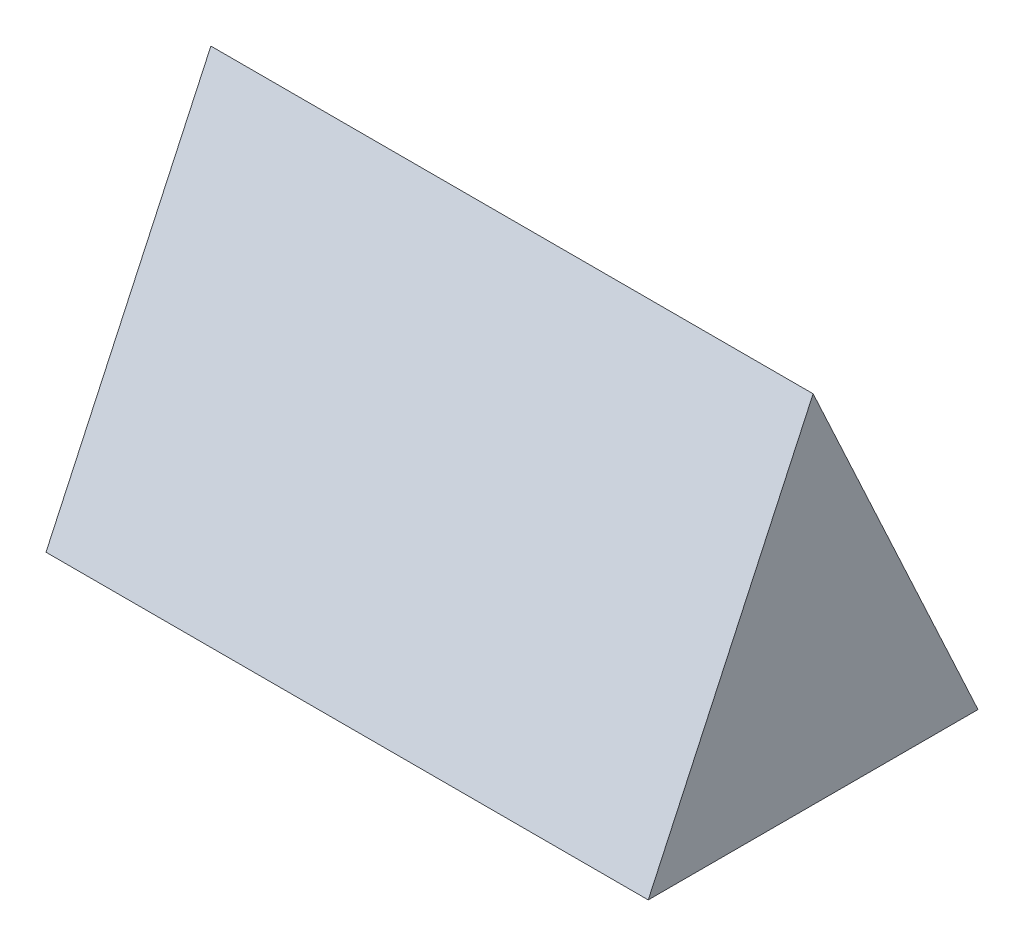
ISO-10303-21;
HEADER;
FILE_DESCRIPTION(('STEP AP214'),'2;1');
FILE_NAME('part.step','',(''),(''),'','','');
FILE_SCHEMA(('AUTOMOTIVE_DESIGN { 1 0 10303 214 1 1 1 1 }'));
ENDSEC;
DATA;
#1=APPLICATION_CONTEXT('core data for automotive mechanical design processes');
#2=APPLICATION_PROTOCOL_DEFINITION('international standard','automotive_design',2000,#1);
#3=PRODUCT_CONTEXT('',#1,'mechanical');
#4=PRODUCT('Part','Part','',(#3));
#5=PRODUCT_RELATED_PRODUCT_CATEGORY('part','',(#4));
#6=PRODUCT_DEFINITION_FORMATION('','',#4);
#7=PRODUCT_DEFINITION_CONTEXT('part definition',#1,'design');
#8=PRODUCT_DEFINITION('design','',#6,#7);
#9=PRODUCT_DEFINITION_SHAPE('','',#8);
#10=(LENGTH_UNIT() NAMED_UNIT(*) SI_UNIT(.MILLI.,.METRE.));
#11=(NAMED_UNIT(*) PLANE_ANGLE_UNIT() SI_UNIT($,.RADIAN.));
#12=(NAMED_UNIT(*) SI_UNIT($,.STERADIAN.) SOLID_ANGLE_UNIT());
#13=UNCERTAINTY_MEASURE_WITH_UNIT(LENGTH_MEASURE(1.E-05),#10,'distance_accuracy_value','');
#14=(GEOMETRIC_REPRESENTATION_CONTEXT(3) GLOBAL_UNCERTAINTY_ASSIGNED_CONTEXT((#13)) GLOBAL_UNIT_ASSIGNED_CONTEXT((#10,
#11,#12)) REPRESENTATION_CONTEXT('',''));
#15=CARTESIAN_POINT('',(0.,0.,0.));
#16=DIRECTION('',(0.,0.,1.));
#17=DIRECTION('',(1.,0.,0.));
#18=AXIS2_PLACEMENT_3D('',#15,#16,#17);
#19=CARTESIAN_POINT('',(-147.,-31.0214859437751,0.));
#20=DIRECTION('',(0.,-1.,0.));
#21=DIRECTION('',(0.,0.,-1.));
#22=AXIS2_PLACEMENT_3D('',#19,#20,#21);
#23=PLANE('',#22);
#24=DIRECTION('',(1.,0.,0.));
#25=VECTOR('',#24,1.);
#26=CARTESIAN_POINT('',(-147.,-31.0214859437751,-75.));
#27=LINE('',#26,#25);
#28=CARTESIAN_POINT('',(-147.,-31.0214859437751,-75.));
#29=VERTEX_POINT('',#28);
#30=CARTESIAN_POINT('',(126.95,-31.0214859437751,-75.));
#31=VERTEX_POINT('',#30);
#32=EDGE_CURVE('E36',#29,#31,#27,.T.);
#33=ORIENTED_EDGE('',*,*,#32,.T.);
#34=DIRECTION('',(0.,0.,-1.));
#35=VECTOR('',#34,1.);
#36=CARTESIAN_POINT('',(126.95,-31.0214859437751,0.));
#37=LINE('',#36,#35);
#38=CARTESIAN_POINT('',(126.95,-31.0214859437751,75.));
#39=VERTEX_POINT('',#38);
#40=EDGE_CURVE('E70',#39,#31,#37,.T.);
#41=ORIENTED_EDGE('',*,*,#40,.F.);
#42=DIRECTION('',(1.,0.,0.));
#43=VECTOR('',#42,1.);
#44=CARTESIAN_POINT('',(-147.,-31.0214859437751,75.));
#45=LINE('',#44,#43);
#46=CARTESIAN_POINT('',(-147.,-31.0214859437751,75.));
#47=VERTEX_POINT('',#46);
#48=EDGE_CURVE('E11',#47,#39,#45,.T.);
#49=ORIENTED_EDGE('',*,*,#48,.F.);
#50=DIRECTION('',(0.,0.,-1.));
#51=VECTOR('',#50,1.);
#52=CARTESIAN_POINT('',(-147.,-31.0214859437751,0.));
#53=LINE('',#52,#51);
#54=EDGE_CURVE('E49',#47,#29,#53,.T.);
#55=ORIENTED_EDGE('',*,*,#54,.T.);
#56=EDGE_LOOP('',(#33,#41,#49,#55));
#57=FACE_BOUND('',#56,.T.);
#58=ADVANCED_FACE('F32',(#57),#23,.T.);
#59=CARTESIAN_POINT('',(-147.,130.878514056225,0.));
#60=DIRECTION('',(0.,0.420337226899562,0.907367960467189));
#61=DIRECTION('',(0.,-0.907367960467189,0.420337226899562));
#62=AXIS2_PLACEMENT_3D('',#59,#60,#61);
#63=PLANE('',#62);
#64=ORIENTED_EDGE('',*,*,#48,.T.);
#65=DIRECTION('',(0.,-0.907367960467189,0.420337226899562));
#66=VECTOR('',#65,1.);
#67=CARTESIAN_POINT('',(126.95,130.878514056225,0.));
#68=LINE('',#67,#66);
#69=CARTESIAN_POINT('',(126.95,130.878514056225,0.));
#70=VERTEX_POINT('',#69);
#71=EDGE_CURVE('E78',#70,#39,#68,.T.);
#72=ORIENTED_EDGE('',*,*,#71,.F.);
#73=DIRECTION('',(1.,0.,0.));
#74=VECTOR('',#73,1.);
#75=CARTESIAN_POINT('',(-147.,130.878514056225,0.));
#76=LINE('',#75,#74);
#77=CARTESIAN_POINT('',(-147.,130.878514056225,0.));
#78=VERTEX_POINT('',#77);
#79=EDGE_CURVE('E41',#78,#70,#76,.T.);
#80=ORIENTED_EDGE('',*,*,#79,.F.);
#81=DIRECTION('',(0.,-0.907367960467189,0.420337226899562));
#82=VECTOR('',#81,1.);
#83=CARTESIAN_POINT('',(-147.,130.878514056225,0.));
#84=LINE('',#83,#82);
#85=EDGE_CURVE('E74',#78,#47,#84,.T.);
#86=ORIENTED_EDGE('',*,*,#85,.T.);
#87=EDGE_LOOP('',(#64,#72,#80,#86));
#88=FACE_BOUND('',#87,.T.);
#89=ADVANCED_FACE('F87',(#88),#63,.T.);
#90=CARTESIAN_POINT('',(-147.,130.878514056225,0.));
#91=DIRECTION('',(0.,0.420337226899562,-0.907367960467189));
#92=DIRECTION('',(0.,0.907367960467189,0.420337226899562));
#93=AXIS2_PLACEMENT_3D('',#90,#91,#92);
#94=PLANE('',#93);
#95=ORIENTED_EDGE('',*,*,#79,.T.);
#96=DIRECTION('',(0.,0.907367960467189,0.420337226899562));
#97=VECTOR('',#96,1.);
#98=CARTESIAN_POINT('',(126.95,130.878514056225,0.));
#99=LINE('',#98,#97);
#100=EDGE_CURVE('E76',#31,#70,#99,.T.);
#101=ORIENTED_EDGE('',*,*,#100,.F.);
#102=ORIENTED_EDGE('',*,*,#32,.F.);
#103=DIRECTION('',(0.,0.907367960467189,0.420337226899562));
#104=VECTOR('',#103,1.);
#105=CARTESIAN_POINT('',(-147.,130.878514056225,0.));
#106=LINE('',#105,#104);
#107=EDGE_CURVE('E85',#29,#78,#106,.T.);
#108=ORIENTED_EDGE('',*,*,#107,.T.);
#109=EDGE_LOOP('',(#95,#101,#102,#108));
#110=FACE_BOUND('',#109,.T.);
#111=ADVANCED_FACE('F34',(#110),#94,.T.);
#112=CARTESIAN_POINT('',(-147.,0.,0.));
#113=DIRECTION('',(-1.,0.,0.));
#114=DIRECTION('',(0.,0.,1.));
#115=AXIS2_PLACEMENT_3D('',#112,#113,#114);
#116=PLANE('',#115);
#117=ORIENTED_EDGE('',*,*,#54,.F.);
#118=ORIENTED_EDGE('',*,*,#85,.F.);
#119=ORIENTED_EDGE('',*,*,#107,.F.);
#120=EDGE_LOOP('',(#117,#118,#119));
#121=FACE_BOUND('',#120,.T.);
#122=ADVANCED_FACE('F88',(#121),#116,.T.);
#123=CARTESIAN_POINT('',(126.95,0.,0.));
#124=DIRECTION('',(-1.,0.,0.));
#125=DIRECTION('',(0.,0.,1.));
#126=AXIS2_PLACEMENT_3D('',#123,#124,#125);
#127=PLANE('',#126);
#128=ORIENTED_EDGE('',*,*,#40,.T.);
#129=ORIENTED_EDGE('',*,*,#100,.T.);
#130=ORIENTED_EDGE('',*,*,#71,.T.);
#131=EDGE_LOOP('',(#128,#129,#130));
#132=FACE_BOUND('',#131,.T.);
#133=ADVANCED_FACE('F80',(#132),#127,.F.);
#134=CLOSED_SHELL('',(#58,#89,#111,#122,#133));
#135=MANIFOLD_SOLID_BREP('B2',#134);
#136=ADVANCED_BREP_SHAPE_REPRESENTATION('',(#18,#135),#14);
#137=SHAPE_DEFINITION_REPRESENTATION(#9,#136);
ENDSEC;
END-ISO-10303-21;
